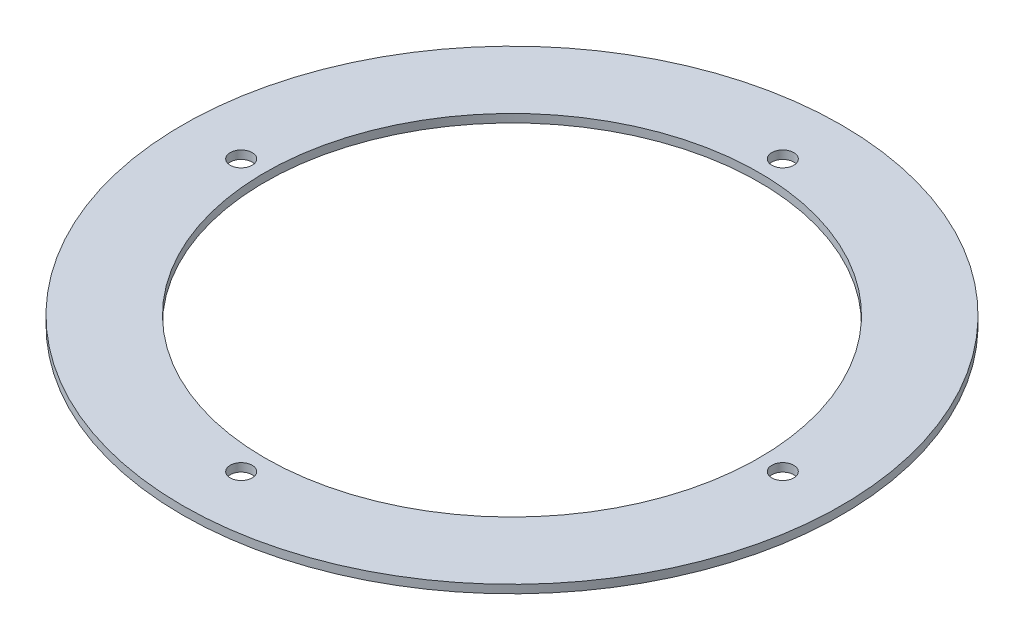
ISO-10303-21;
HEADER;
FILE_DESCRIPTION(('STEP AP214'),'2;1');
FILE_NAME('part.step','',(''),(''),'','','');
FILE_SCHEMA(('AUTOMOTIVE_DESIGN { 1 0 10303 214 1 1 1 1 }'));
ENDSEC;
DATA;
#1=APPLICATION_CONTEXT('core data for automotive mechanical design processes');
#2=APPLICATION_PROTOCOL_DEFINITION('international standard','automotive_design',2000,#1);
#3=PRODUCT_CONTEXT('',#1,'mechanical');
#4=PRODUCT('Part','Part','',(#3));
#5=PRODUCT_RELATED_PRODUCT_CATEGORY('part','',(#4));
#6=PRODUCT_DEFINITION_FORMATION('','',#4);
#7=PRODUCT_DEFINITION_CONTEXT('part definition',#1,'design');
#8=PRODUCT_DEFINITION('design','',#6,#7);
#9=PRODUCT_DEFINITION_SHAPE('','',#8);
#10=(LENGTH_UNIT() NAMED_UNIT(*) SI_UNIT(.MILLI.,.METRE.));
#11=(NAMED_UNIT(*) PLANE_ANGLE_UNIT() SI_UNIT($,.RADIAN.));
#12=(NAMED_UNIT(*) SI_UNIT($,.STERADIAN.) SOLID_ANGLE_UNIT());
#13=UNCERTAINTY_MEASURE_WITH_UNIT(LENGTH_MEASURE(1.E-05),#10,'distance_accuracy_value','');
#14=(GEOMETRIC_REPRESENTATION_CONTEXT(3) GLOBAL_UNCERTAINTY_ASSIGNED_CONTEXT((#13)) GLOBAL_UNIT_ASSIGNED_CONTEXT((#10,
#11,#12)) REPRESENTATION_CONTEXT('',''));
#15=CARTESIAN_POINT('',(0.,0.,0.));
#16=DIRECTION('',(0.,0.,1.));
#17=DIRECTION('',(1.,0.,0.));
#18=AXIS2_PLACEMENT_3D('',#15,#16,#17);
#19=CARTESIAN_POINT('',(0.,1.5,0.));
#20=DIRECTION('',(0.,1.,0.));
#21=DIRECTION('',(0.,0.,1.));
#22=AXIS2_PLACEMENT_3D('',#19,#20,#21);
#23=PLANE('',#22);
#24=CARTESIAN_POINT('',(0.,1.5,49.3));
#25=DIRECTION('',(0.,1.,0.));
#26=DIRECTION('',(0.,0.,1.));
#27=AXIS2_PLACEMENT_3D('',#24,#25,#26);
#28=CIRCLE('',#27,2.);
#29=CARTESIAN_POINT('',(0.,1.5,51.3));
#30=VERTEX_POINT('',#29);
#31=EDGE_CURVE('E82',#30,#30,#28,.T.);
#32=ORIENTED_EDGE('',*,*,#31,.F.);
#33=EDGE_LOOP('',(#32));
#34=FACE_BOUND('',#33,.T.);
#35=CARTESIAN_POINT('',(0.,1.5,-49.3));
#36=DIRECTION('',(0.,1.,0.));
#37=DIRECTION('',(0.,0.,1.));
#38=AXIS2_PLACEMENT_3D('',#35,#36,#37);
#39=CIRCLE('',#38,2.);
#40=CARTESIAN_POINT('',(0.,1.5,-47.3));
#41=VERTEX_POINT('',#40);
#42=EDGE_CURVE('E66',#41,#41,#39,.T.);
#43=ORIENTED_EDGE('',*,*,#42,.F.);
#44=EDGE_LOOP('',(#43));
#45=FACE_BOUND('',#44,.T.);
#46=CARTESIAN_POINT('',(0.,1.5,0.));
#47=DIRECTION('',(0.,1.,0.));
#48=DIRECTION('',(0.,0.,1.));
#49=AXIS2_PLACEMENT_3D('',#46,#47,#48);
#50=CIRCLE('',#49,60.);
#51=CARTESIAN_POINT('',(0.,1.5,60.));
#52=VERTEX_POINT('',#51);
#53=EDGE_CURVE('E10',#52,#52,#50,.T.);
#54=ORIENTED_EDGE('',*,*,#53,.T.);
#55=EDGE_LOOP('',(#54));
#56=FACE_BOUND('',#55,.T.);
#57=CARTESIAN_POINT('',(0.,1.5,0.));
#58=DIRECTION('',(0.,1.,0.));
#59=DIRECTION('',(0.,0.,1.));
#60=AXIS2_PLACEMENT_3D('',#57,#58,#59);
#61=CIRCLE('',#60,45.);
#62=CARTESIAN_POINT('',(0.,1.5,45.));
#63=VERTEX_POINT('',#62);
#64=EDGE_CURVE('E60',#63,#63,#61,.T.);
#65=ORIENTED_EDGE('',*,*,#64,.F.);
#66=EDGE_LOOP('',(#65));
#67=FACE_BOUND('',#66,.T.);
#68=CARTESIAN_POINT('',(49.3,1.5,0.));
#69=DIRECTION('',(0.,1.,0.));
#70=DIRECTION('',(0.,0.,1.));
#71=AXIS2_PLACEMENT_3D('',#68,#69,#70);
#72=CIRCLE('',#71,2.);
#73=CARTESIAN_POINT('',(49.3,1.5,2.));
#74=VERTEX_POINT('',#73);
#75=EDGE_CURVE('E74',#74,#74,#72,.T.);
#76=ORIENTED_EDGE('',*,*,#75,.F.);
#77=EDGE_LOOP('',(#76));
#78=FACE_BOUND('',#77,.T.);
#79=CARTESIAN_POINT('',(-49.3,1.5,0.));
#80=DIRECTION('',(0.,1.,0.));
#81=DIRECTION('',(0.,0.,1.));
#82=AXIS2_PLACEMENT_3D('',#79,#80,#81);
#83=CIRCLE('',#82,2.);
#84=CARTESIAN_POINT('',(-49.3,1.5,2.));
#85=VERTEX_POINT('',#84);
#86=EDGE_CURVE('E90',#85,#85,#83,.T.);
#87=ORIENTED_EDGE('',*,*,#86,.F.);
#88=EDGE_LOOP('',(#87));
#89=FACE_BOUND('',#88,.T.);
#90=ADVANCED_FACE('F47',(#34,#45,#56,#67,#78,#89),#23,.T.);
#91=CARTESIAN_POINT('',(0.,0.,0.));
#92=DIRECTION('',(0.,1.,0.));
#93=DIRECTION('',(0.,0.,1.));
#94=AXIS2_PLACEMENT_3D('',#91,#92,#93);
#95=PLANE('',#94);
#96=CARTESIAN_POINT('',(0.,0.,0.));
#97=DIRECTION('',(0.,1.,0.));
#98=DIRECTION('',(0.,0.,1.));
#99=AXIS2_PLACEMENT_3D('',#96,#97,#98);
#100=CIRCLE('',#99,60.);
#101=CARTESIAN_POINT('',(0.,0.,60.));
#102=VERTEX_POINT('',#101);
#103=EDGE_CURVE('E51',#102,#102,#100,.T.);
#104=ORIENTED_EDGE('',*,*,#103,.F.);
#105=EDGE_LOOP('',(#104));
#106=FACE_BOUND('',#105,.T.);
#107=CARTESIAN_POINT('',(0.,0.,0.));
#108=DIRECTION('',(0.,1.,0.));
#109=DIRECTION('',(0.,0.,1.));
#110=AXIS2_PLACEMENT_3D('',#107,#108,#109);
#111=CIRCLE('',#110,45.);
#112=CARTESIAN_POINT('',(0.,0.,45.));
#113=VERTEX_POINT('',#112);
#114=EDGE_CURVE('E62',#113,#113,#111,.T.);
#115=ORIENTED_EDGE('',*,*,#114,.T.);
#116=EDGE_LOOP('',(#115));
#117=FACE_BOUND('',#116,.T.);
#118=CARTESIAN_POINT('',(0.,0.,-49.3));
#119=DIRECTION('',(0.,1.,0.));
#120=DIRECTION('',(0.,0.,1.));
#121=AXIS2_PLACEMENT_3D('',#118,#119,#120);
#122=CIRCLE('',#121,2.);
#123=CARTESIAN_POINT('',(0.,0.,-47.3));
#124=VERTEX_POINT('',#123);
#125=EDGE_CURVE('E70',#124,#124,#122,.T.);
#126=ORIENTED_EDGE('',*,*,#125,.T.);
#127=EDGE_LOOP('',(#126));
#128=FACE_BOUND('',#127,.T.);
#129=CARTESIAN_POINT('',(49.3,0.,0.));
#130=DIRECTION('',(0.,1.,0.));
#131=DIRECTION('',(0.,0.,1.));
#132=AXIS2_PLACEMENT_3D('',#129,#130,#131);
#133=CIRCLE('',#132,2.);
#134=CARTESIAN_POINT('',(49.3,0.,2.));
#135=VERTEX_POINT('',#134);
#136=EDGE_CURVE('E78',#135,#135,#133,.T.);
#137=ORIENTED_EDGE('',*,*,#136,.T.);
#138=EDGE_LOOP('',(#137));
#139=FACE_BOUND('',#138,.T.);
#140=CARTESIAN_POINT('',(0.,0.,49.3));
#141=DIRECTION('',(0.,1.,0.));
#142=DIRECTION('',(0.,0.,1.));
#143=AXIS2_PLACEMENT_3D('',#140,#141,#142);
#144=CIRCLE('',#143,2.);
#145=CARTESIAN_POINT('',(0.,0.,51.3));
#146=VERTEX_POINT('',#145);
#147=EDGE_CURVE('E86',#146,#146,#144,.T.);
#148=ORIENTED_EDGE('',*,*,#147,.T.);
#149=EDGE_LOOP('',(#148));
#150=FACE_BOUND('',#149,.T.);
#151=CARTESIAN_POINT('',(-49.3,0.,0.));
#152=DIRECTION('',(0.,1.,0.));
#153=DIRECTION('',(0.,0.,1.));
#154=AXIS2_PLACEMENT_3D('',#151,#152,#153);
#155=CIRCLE('',#154,2.);
#156=CARTESIAN_POINT('',(-49.3,0.,2.));
#157=VERTEX_POINT('',#156);
#158=EDGE_CURVE('E94',#157,#157,#155,.T.);
#159=ORIENTED_EDGE('',*,*,#158,.T.);
#160=EDGE_LOOP('',(#159));
#161=FACE_BOUND('',#160,.T.);
#162=ADVANCED_FACE('F106',(#106,#117,#128,#139,#150,#161),#95,.F.);
#163=CARTESIAN_POINT('',(0.,1.5,0.));
#164=DIRECTION('',(0.,-1.,0.));
#165=DIRECTION('',(0.,0.,-1.));
#166=AXIS2_PLACEMENT_3D('',#163,#164,#165);
#167=CYLINDRICAL_SURFACE('',#166,60.);
#168=ORIENTED_EDGE('',*,*,#53,.F.);
#169=EDGE_LOOP('',(#168));
#170=FACE_BOUND('',#169,.T.);
#171=ORIENTED_EDGE('',*,*,#103,.T.);
#172=EDGE_LOOP('',(#171));
#173=FACE_BOUND('',#172,.T.);
#174=ADVANCED_FACE('F49',(#170,#173),#167,.T.);
#175=CARTESIAN_POINT('',(0.,1.5,0.));
#176=DIRECTION('',(0.,-1.,0.));
#177=DIRECTION('',(0.,0.,-1.));
#178=AXIS2_PLACEMENT_3D('',#175,#176,#177);
#179=CYLINDRICAL_SURFACE('',#178,45.);
#180=ORIENTED_EDGE('',*,*,#64,.T.);
#181=EDGE_LOOP('',(#180));
#182=FACE_BOUND('',#181,.T.);
#183=ORIENTED_EDGE('',*,*,#114,.F.);
#184=EDGE_LOOP('',(#183));
#185=FACE_BOUND('',#184,.T.);
#186=ADVANCED_FACE('F116',(#182,#185),#179,.F.);
#187=CARTESIAN_POINT('',(0.,1.5,-49.3));
#188=DIRECTION('',(0.,-1.,0.));
#189=DIRECTION('',(0.,0.,-1.));
#190=AXIS2_PLACEMENT_3D('',#187,#188,#189);
#191=CYLINDRICAL_SURFACE('',#190,2.);
#192=ORIENTED_EDGE('',*,*,#42,.T.);
#193=EDGE_LOOP('',(#192));
#194=FACE_BOUND('',#193,.T.);
#195=ORIENTED_EDGE('',*,*,#125,.F.);
#196=EDGE_LOOP('',(#195));
#197=FACE_BOUND('',#196,.T.);
#198=ADVANCED_FACE('F119',(#194,#197),#191,.F.);
#199=CARTESIAN_POINT('',(49.3,1.5,0.));
#200=DIRECTION('',(0.,-1.,0.));
#201=DIRECTION('',(0.,0.,-1.));
#202=AXIS2_PLACEMENT_3D('',#199,#200,#201);
#203=CYLINDRICAL_SURFACE('',#202,2.);
#204=ORIENTED_EDGE('',*,*,#75,.T.);
#205=EDGE_LOOP('',(#204));
#206=FACE_BOUND('',#205,.T.);
#207=ORIENTED_EDGE('',*,*,#136,.F.);
#208=EDGE_LOOP('',(#207));
#209=FACE_BOUND('',#208,.T.);
#210=ADVANCED_FACE('F123',(#206,#209),#203,.F.);
#211=CARTESIAN_POINT('',(0.,1.5,49.3));
#212=DIRECTION('',(0.,-1.,0.));
#213=DIRECTION('',(0.,0.,-1.));
#214=AXIS2_PLACEMENT_3D('',#211,#212,#213);
#215=CYLINDRICAL_SURFACE('',#214,2.);
#216=ORIENTED_EDGE('',*,*,#31,.T.);
#217=EDGE_LOOP('',(#216));
#218=FACE_BOUND('',#217,.T.);
#219=ORIENTED_EDGE('',*,*,#147,.F.);
#220=EDGE_LOOP('',(#219));
#221=FACE_BOUND('',#220,.T.);
#222=ADVANCED_FACE('F127',(#218,#221),#215,.F.);
#223=CARTESIAN_POINT('',(-49.3,1.5,0.));
#224=DIRECTION('',(0.,-1.,0.));
#225=DIRECTION('',(0.,0.,-1.));
#226=AXIS2_PLACEMENT_3D('',#223,#224,#225);
#227=CYLINDRICAL_SURFACE('',#226,2.);
#228=ORIENTED_EDGE('',*,*,#86,.T.);
#229=EDGE_LOOP('',(#228));
#230=FACE_BOUND('',#229,.T.);
#231=ORIENTED_EDGE('',*,*,#158,.F.);
#232=EDGE_LOOP('',(#231));
#233=FACE_BOUND('',#232,.T.);
#234=ADVANCED_FACE('F102',(#230,#233),#227,.F.);
#235=CLOSED_SHELL('',(#90,#162,#174,#186,#198,#210,#222,#234));
#236=MANIFOLD_SOLID_BREP('B2',#235);
#237=ADVANCED_BREP_SHAPE_REPRESENTATION('',(#18,#236),#14);
#238=SHAPE_DEFINITION_REPRESENTATION(#9,#237);
ENDSEC;
END-ISO-10303-21;
